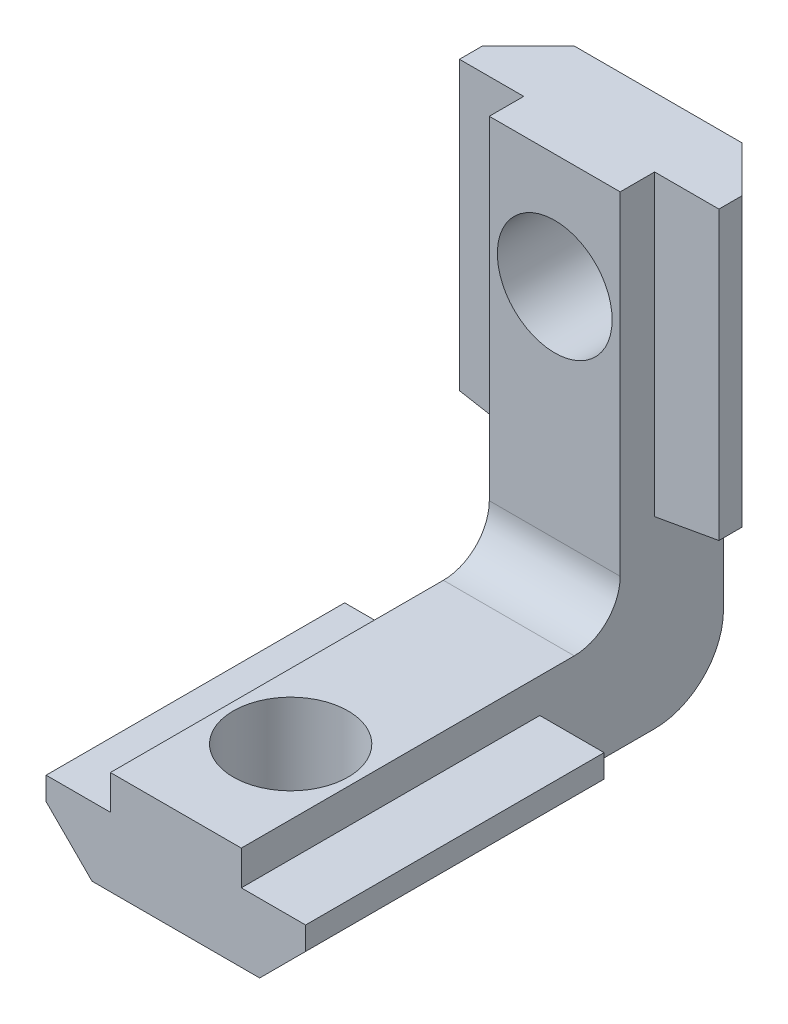
ISO-10303-21;
HEADER;
FILE_DESCRIPTION(('STEP AP214'),'2;1');
FILE_NAME('part.step','',(''),(''),'','','');
FILE_SCHEMA(('AUTOMOTIVE_DESIGN { 1 0 10303 214 1 1 1 1 }'));
ENDSEC;
DATA;
#1=APPLICATION_CONTEXT('core data for automotive mechanical design processes');
#2=APPLICATION_PROTOCOL_DEFINITION('international standard','automotive_design',2000,#1);
#3=PRODUCT_CONTEXT('',#1,'mechanical');
#4=PRODUCT('Part','Part','',(#3));
#5=PRODUCT_RELATED_PRODUCT_CATEGORY('part','',(#4));
#6=PRODUCT_DEFINITION_FORMATION('','',#4);
#7=PRODUCT_DEFINITION_CONTEXT('part definition',#1,'design');
#8=PRODUCT_DEFINITION('design','',#6,#7);
#9=PRODUCT_DEFINITION_SHAPE('','',#8);
#10=(LENGTH_UNIT() NAMED_UNIT(*) SI_UNIT(.MILLI.,.METRE.));
#11=(NAMED_UNIT(*) PLANE_ANGLE_UNIT() SI_UNIT($,.RADIAN.));
#12=(NAMED_UNIT(*) SI_UNIT($,.STERADIAN.) SOLID_ANGLE_UNIT());
#13=UNCERTAINTY_MEASURE_WITH_UNIT(LENGTH_MEASURE(1.E-05),#10,'distance_accuracy_value','');
#14=(GEOMETRIC_REPRESENTATION_CONTEXT(3) GLOBAL_UNCERTAINTY_ASSIGNED_CONTEXT((#13)) GLOBAL_UNIT_ASSIGNED_CONTEXT((#10,
#11,#12)) REPRESENTATION_CONTEXT('',''));
#15=CARTESIAN_POINT('',(0.,0.,0.));
#16=DIRECTION('',(0.,0.,1.));
#17=DIRECTION('',(1.,0.,0.));
#18=AXIS2_PLACEMENT_3D('',#15,#16,#17);
#19=CARTESIAN_POINT('',(2.85,3.,0.));
#20=DIRECTION('',(0.,0.,1.));
#21=DIRECTION('',(1.,0.,0.));
#22=AXIS2_PLACEMENT_3D('',#19,#20,#21);
#23=PLANE('',#22);
#24=DIRECTION('',(-1.,0.,0.));
#25=VECTOR('',#24,1.);
#26=CARTESIAN_POINT('',(2.85,3.,0.));
#27=LINE('',#26,#25);
#28=CARTESIAN_POINT('',(2.85,3.,0.));
#29=VERTEX_POINT('',#28);
#30=CARTESIAN_POINT('',(-2.85,3.,0.));
#31=VERTEX_POINT('',#30);
#32=EDGE_CURVE('E245',#29,#31,#27,.T.);
#33=ORIENTED_EDGE('',*,*,#32,.T.);
#34=DIRECTION('',(0.,1.,0.));
#35=VECTOR('',#34,1.);
#36=CARTESIAN_POINT('',(-2.85,3.,0.));
#37=LINE('',#36,#35);
#38=CARTESIAN_POINT('',(-2.85,8.,0.));
#39=VERTEX_POINT('',#38);
#40=EDGE_CURVE('E283',#31,#39,#37,.T.);
#41=ORIENTED_EDGE('',*,*,#40,.T.);
#42=DIRECTION('',(-0.984427575508482,0.175790638483658,0.));
#43=VECTOR('',#42,1.);
#44=CARTESIAN_POINT('',(-5.65,8.5,0.));
#45=LINE('',#44,#43);
#46=CARTESIAN_POINT('',(-3.65000000000001,8.14285714285715,0.));
#47=VERTEX_POINT('',#46);
#48=EDGE_CURVE('E461',#39,#47,#45,.T.);
#49=ORIENTED_EDGE('',*,*,#48,.T.);
#50=DIRECTION('',(0.,1.,0.));
#51=VECTOR('',#50,1.);
#52=CARTESIAN_POINT('',(-3.65000000000001,8.,0.));
#53=LINE('',#52,#51);
#54=CARTESIAN_POINT('',(-3.65000000000001,21.,0.));
#55=VERTEX_POINT('',#54);
#56=EDGE_CURVE('E467',#47,#55,#53,.T.);
#57=ORIENTED_EDGE('',*,*,#56,.T.);
#58=DIRECTION('',(-1.,0.,0.));
#59=VECTOR('',#58,1.);
#60=CARTESIAN_POINT('',(-3.65000000000001,21.,0.));
#61=LINE('',#60,#59);
#62=CARTESIAN_POINT('',(3.65000000000001,21.,0.));
#63=VERTEX_POINT('',#62);
#64=EDGE_CURVE('E464',#63,#55,#61,.T.);
#65=ORIENTED_EDGE('',*,*,#64,.F.);
#66=DIRECTION('',(0.,1.,0.));
#67=VECTOR('',#66,1.);
#68=CARTESIAN_POINT('',(3.65000000000001,8.,0.));
#69=LINE('',#68,#67);
#70=CARTESIAN_POINT('',(3.65000000000001,8.14285714285715,0.));
#71=VERTEX_POINT('',#70);
#72=EDGE_CURVE('E457',#71,#63,#69,.T.);
#73=ORIENTED_EDGE('',*,*,#72,.F.);
#74=DIRECTION('',(-0.984427575508482,-0.175790638483658,0.));
#75=VECTOR('',#74,1.);
#76=CARTESIAN_POINT('',(5.65,8.5,0.));
#77=LINE('',#76,#75);
#78=CARTESIAN_POINT('',(2.85,8.,0.));
#79=VERTEX_POINT('',#78);
#80=EDGE_CURVE('E383',#71,#79,#77,.T.);
#81=ORIENTED_EDGE('',*,*,#80,.T.);
#82=DIRECTION('',(0.,1.,0.));
#83=VECTOR('',#82,1.);
#84=CARTESIAN_POINT('',(2.85,3.,0.));
#85=LINE('',#84,#83);
#86=EDGE_CURVE('E268',#29,#79,#85,.T.);
#87=ORIENTED_EDGE('',*,*,#86,.F.);
#88=EDGE_LOOP('',(#33,#41,#49,#57,#65,#73,#81,#87));
#89=FACE_BOUND('',#88,.T.);
#90=CARTESIAN_POINT('',(0.,16.,0.));
#91=DIRECTION('',(0.,0.,1.));
#92=DIRECTION('',(1.,0.,0.));
#93=AXIS2_PLACEMENT_3D('',#90,#91,#92);
#94=CIRCLE('',#93,2.5);
#95=CARTESIAN_POINT('',(2.5,16.,0.));
#96=VERTEX_POINT('',#95);
#97=EDGE_CURVE('E532',#96,#96,#94,.T.);
#98=ORIENTED_EDGE('',*,*,#97,.T.);
#99=EDGE_LOOP('',(#98));
#100=FACE_BOUND('',#99,.T.);
#101=ADVANCED_FACE('F41',(#89,#100),#23,.F.);
#102=CARTESIAN_POINT('',(2.85,6.5,4.5));
#103=DIRECTION('',(0.,0.,-1.));
#104=DIRECTION('',(-1.,0.,0.));
#105=AXIS2_PLACEMENT_3D('',#102,#103,#104);
#106=PLANE('',#105);
#107=DIRECTION('',(0.,-1.,0.));
#108=VECTOR('',#107,1.);
#109=CARTESIAN_POINT('',(2.85,6.5,4.5));
#110=LINE('',#109,#108);
#111=CARTESIAN_POINT('',(2.85,21.,4.5));
#112=VERTEX_POINT('',#111);
#113=CARTESIAN_POINT('',(2.85,6.5,4.5));
#114=VERTEX_POINT('',#113);
#115=EDGE_CURVE('E261',#112,#114,#110,.T.);
#116=ORIENTED_EDGE('',*,*,#115,.F.);
#117=DIRECTION('',(1.,0.,0.));
#118=VECTOR('',#117,1.);
#119=CARTESIAN_POINT('',(-2.85,21.,4.5));
#120=LINE('',#119,#118);
#121=CARTESIAN_POINT('',(-2.85,21.,4.5));
#122=VERTEX_POINT('',#121);
#123=EDGE_CURVE('E508',#122,#112,#120,.T.);
#124=ORIENTED_EDGE('',*,*,#123,.F.);
#125=DIRECTION('',(0.,-1.,0.));
#126=VECTOR('',#125,1.);
#127=CARTESIAN_POINT('',(-2.85,6.5,4.5));
#128=LINE('',#127,#126);
#129=CARTESIAN_POINT('',(-2.85,6.5,4.5));
#130=VERTEX_POINT('',#129);
#131=EDGE_CURVE('E282',#122,#130,#128,.T.);
#132=ORIENTED_EDGE('',*,*,#131,.T.);
#133=DIRECTION('',(-1.,0.,0.));
#134=VECTOR('',#133,1.);
#135=CARTESIAN_POINT('',(2.85,6.5,4.5));
#136=LINE('',#135,#134);
#137=EDGE_CURVE('E249',#114,#130,#136,.T.);
#138=ORIENTED_EDGE('',*,*,#137,.F.);
#139=EDGE_LOOP('',(#116,#124,#132,#138));
#140=FACE_BOUND('',#139,.T.);
#141=CARTESIAN_POINT('',(0.,16.,4.5));
#142=DIRECTION('',(0.,0.,1.));
#143=DIRECTION('',(1.,0.,0.));
#144=AXIS2_PLACEMENT_3D('',#141,#142,#143);
#145=CIRCLE('',#144,2.5);
#146=CARTESIAN_POINT('',(2.5,16.,4.5));
#147=VERTEX_POINT('',#146);
#148=EDGE_CURVE('E451',#147,#147,#145,.T.);
#149=ORIENTED_EDGE('',*,*,#148,.F.);
#150=EDGE_LOOP('',(#149));
#151=FACE_BOUND('',#150,.T.);
#152=ADVANCED_FACE('F547',(#140,#151),#106,.F.);
#153=CARTESIAN_POINT('',(-2.85,3.,8.));
#154=DIRECTION('',(0.,0.,1.));
#155=DIRECTION('',(1.,0.,0.));
#156=AXIS2_PLACEMENT_3D('',#153,#154,#155);
#157=PLANE('',#156);
#158=DIRECTION('',(0.,-1.,0.));
#159=VECTOR('',#158,1.);
#160=CARTESIAN_POINT('',(2.85,4.5,8.));
#161=LINE('',#160,#159);
#162=CARTESIAN_POINT('',(2.85,3.,8.));
#163=VERTEX_POINT('',#162);
#164=CARTESIAN_POINT('',(2.85,0.,8.));
#165=VERTEX_POINT('',#164);
#166=EDGE_CURVE('E51',#163,#165,#161,.T.);
#167=ORIENTED_EDGE('',*,*,#166,.F.);
#168=DIRECTION('',(-1.,0.,0.));
#169=VECTOR('',#168,1.);
#170=CARTESIAN_POINT('',(5.65,3.,8.));
#171=LINE('',#170,#169);
#172=CARTESIAN_POINT('',(5.65,3.,8.));
#173=VERTEX_POINT('',#172);
#174=EDGE_CURVE('E131',#173,#163,#171,.T.);
#175=ORIENTED_EDGE('',*,*,#174,.F.);
#176=DIRECTION('',(0.,1.,0.));
#177=VECTOR('',#176,1.);
#178=CARTESIAN_POINT('',(5.65,2.,8.));
#179=LINE('',#178,#177);
#180=CARTESIAN_POINT('',(5.65,2.,8.));
#181=VERTEX_POINT('',#180);
#182=EDGE_CURVE('E146',#181,#173,#179,.T.);
#183=ORIENTED_EDGE('',*,*,#182,.F.);
#184=DIRECTION('',(0.707106781186551,0.707106781186544,0.));
#185=VECTOR('',#184,1.);
#186=CARTESIAN_POINT('',(3.64999999999998,0.,8.));
#187=LINE('',#186,#185);
#188=CARTESIAN_POINT('',(3.64999999999998,0.,8.));
#189=VERTEX_POINT('',#188);
#190=EDGE_CURVE('E155',#189,#181,#187,.T.);
#191=ORIENTED_EDGE('',*,*,#190,.F.);
#192=DIRECTION('',(1.,0.,0.));
#193=VECTOR('',#192,1.);
#194=CARTESIAN_POINT('',(-3.64999999999998,0.,8.));
#195=LINE('',#194,#193);
#196=EDGE_CURVE('E222',#165,#189,#195,.T.);
#197=ORIENTED_EDGE('',*,*,#196,.F.);
#198=EDGE_LOOP('',(#167,#175,#183,#191,#197));
#199=FACE_BOUND('',#198,.T.);
#200=ADVANCED_FACE('F144',(#199),#157,.F.);
#201=CARTESIAN_POINT('',(-5.65,3.,8.));
#202=DIRECTION('',(0.,1.,0.));
#203=DIRECTION('',(0.,0.,1.));
#204=AXIS2_PLACEMENT_3D('',#201,#202,#203);
#205=PLANE('',#204);
#206=DIRECTION('',(-1.,0.,0.));
#207=VECTOR('',#206,1.);
#208=CARTESIAN_POINT('',(-5.65,3.,21.));
#209=LINE('',#208,#207);
#210=CARTESIAN_POINT('',(-2.85,3.,21.));
#211=VERTEX_POINT('',#210);
#212=CARTESIAN_POINT('',(-5.65,3.,21.));
#213=VERTEX_POINT('',#212);
#214=EDGE_CURVE('E162',#211,#213,#209,.T.);
#215=ORIENTED_EDGE('',*,*,#214,.F.);
#216=DIRECTION('',(0.,0.,1.));
#217=VECTOR('',#216,1.);
#218=CARTESIAN_POINT('',(-2.85,3.,8.));
#219=LINE('',#218,#217);
#220=CARTESIAN_POINT('',(-2.85,3.,8.));
#221=VERTEX_POINT('',#220);
#222=EDGE_CURVE('E66',#221,#211,#219,.T.);
#223=ORIENTED_EDGE('',*,*,#222,.F.);
#224=DIRECTION('',(-1.,0.,0.));
#225=VECTOR('',#224,1.);
#226=CARTESIAN_POINT('',(-5.65,3.,8.));
#227=LINE('',#226,#225);
#228=CARTESIAN_POINT('',(-5.65,3.,8.));
#229=VERTEX_POINT('',#228);
#230=EDGE_CURVE('E200',#221,#229,#227,.T.);
#231=ORIENTED_EDGE('',*,*,#230,.T.);
#232=DIRECTION('',(0.,0.,1.));
#233=VECTOR('',#232,1.);
#234=CARTESIAN_POINT('',(-5.65,3.,8.));
#235=LINE('',#234,#233);
#236=EDGE_CURVE('E109',#229,#213,#235,.T.);
#237=ORIENTED_EDGE('',*,*,#236,.T.);
#238=EDGE_LOOP('',(#215,#223,#231,#237));
#239=FACE_BOUND('',#238,.T.);
#240=ADVANCED_FACE('F43',(#239),#205,.T.);
#241=CARTESIAN_POINT('',(-2.85,3.,8.));
#242=DIRECTION('',(-1.,0.,0.));
#243=DIRECTION('',(0.,0.,1.));
#244=AXIS2_PLACEMENT_3D('',#241,#242,#243);
#245=PLANE('',#244);
#246=DIRECTION('',(0.,-1.,0.));
#247=VECTOR('',#246,1.);
#248=CARTESIAN_POINT('',(-2.85,3.,21.));
#249=LINE('',#248,#247);
#250=CARTESIAN_POINT('',(-2.85,4.5,21.));
#251=VERTEX_POINT('',#250);
#252=EDGE_CURVE('E196',#251,#211,#249,.T.);
#253=ORIENTED_EDGE('',*,*,#252,.F.);
#254=DIRECTION('',(0.,0.,1.));
#255=VECTOR('',#254,1.);
#256=CARTESIAN_POINT('',(-2.85,4.5,8.));
#257=LINE('',#256,#255);
#258=CARTESIAN_POINT('',(-2.85,4.5,6.5));
#259=VERTEX_POINT('',#258);
#260=EDGE_CURVE('E201',#259,#251,#257,.T.);
#261=ORIENTED_EDGE('',*,*,#260,.F.);
#262=CARTESIAN_POINT('',(-2.85,6.5,6.5));
#263=DIRECTION('',(-1.,0.,0.));
#264=DIRECTION('',(0.,0.,-1.));
#265=AXIS2_PLACEMENT_3D('',#262,#263,#264);
#266=CIRCLE('',#265,2.);
#267=EDGE_CURVE('E293',#130,#259,#266,.T.);
#268=ORIENTED_EDGE('',*,*,#267,.F.);
#269=ORIENTED_EDGE('',*,*,#131,.F.);
#270=DIRECTION('',(0.,0.,1.));
#271=VECTOR('',#270,1.);
#272=CARTESIAN_POINT('',(-2.85,21.,4.5));
#273=LINE('',#272,#271);
#274=CARTESIAN_POINT('',(-2.85,21.,3.));
#275=VERTEX_POINT('',#274);
#276=EDGE_CURVE('E512',#275,#122,#273,.T.);
#277=ORIENTED_EDGE('',*,*,#276,.F.);
#278=DIRECTION('',(0.,1.,0.));
#279=VECTOR('',#278,1.);
#280=CARTESIAN_POINT('',(-2.85,8.,3.));
#281=LINE('',#280,#279);
#282=CARTESIAN_POINT('',(-2.85,8.,3.));
#283=VERTEX_POINT('',#282);
#284=EDGE_CURVE('E320',#283,#275,#281,.T.);
#285=ORIENTED_EDGE('',*,*,#284,.F.);
#286=DIRECTION('',(0.,0.,1.));
#287=VECTOR('',#286,1.);
#288=CARTESIAN_POINT('',(-2.85,8.,0.));
#289=LINE('',#288,#287);
#290=EDGE_CURVE('E277',#39,#283,#289,.T.);
#291=ORIENTED_EDGE('',*,*,#290,.F.);
#292=ORIENTED_EDGE('',*,*,#40,.F.);
#293=CARTESIAN_POINT('',(-2.85,3.,3.));
#294=DIRECTION('',(1.,0.,0.));
#295=DIRECTION('',(0.,0.,-1.));
#296=AXIS2_PLACEMENT_3D('',#293,#294,#295);
#297=CIRCLE('',#296,3.);
#298=CARTESIAN_POINT('',(-2.85,0.,3.));
#299=VERTEX_POINT('',#298);
#300=EDGE_CURVE('E308',#299,#31,#297,.T.);
#301=ORIENTED_EDGE('',*,*,#300,.F.);
#302=DIRECTION('',(0.,0.,-1.));
#303=VECTOR('',#302,1.);
#304=CARTESIAN_POINT('',(-2.85,0.,8.));
#305=LINE('',#304,#303);
#306=CARTESIAN_POINT('',(-2.85,0.,8.));
#307=VERTEX_POINT('',#306);
#308=EDGE_CURVE('E311',#307,#299,#305,.T.);
#309=ORIENTED_EDGE('',*,*,#308,.F.);
#310=DIRECTION('',(0.,-1.,0.));
#311=VECTOR('',#310,1.);
#312=CARTESIAN_POINT('',(-2.85,4.5,8.));
#313=LINE('',#312,#311);
#314=EDGE_CURVE('E11',#221,#307,#313,.T.);
#315=ORIENTED_EDGE('',*,*,#314,.F.);
#316=ORIENTED_EDGE('',*,*,#222,.T.);
#317=EDGE_LOOP('',(#253,#261,#268,#269,#277,#285,#291,#292,#301,#309,#315,#316));
#318=FACE_BOUND('',#317,.T.);
#319=ADVANCED_FACE('F570',(#318),#245,.T.);
#320=CARTESIAN_POINT('',(-2.85,4.5,8.));
#321=DIRECTION('',(0.,1.,0.));
#322=DIRECTION('',(-1.,0.,0.));
#323=AXIS2_PLACEMENT_3D('',#320,#321,#322);
#324=PLANE('',#323);
#325=CARTESIAN_POINT('',(0.,4.5,16.));
#326=DIRECTION('',(0.,1.,0.));
#327=DIRECTION('',(-1.,0.,0.));
#328=AXIS2_PLACEMENT_3D('',#325,#326,#327);
#329=CIRCLE('',#328,2.5);
#330=CARTESIAN_POINT('',(-2.5,4.5,16.));
#331=VERTEX_POINT('',#330);
#332=EDGE_CURVE('E234',#331,#331,#329,.T.);
#333=ORIENTED_EDGE('',*,*,#332,.F.);
#334=EDGE_LOOP('',(#333));
#335=FACE_BOUND('',#334,.T.);
#336=DIRECTION('',(-1.,0.,0.));
#337=VECTOR('',#336,1.);
#338=CARTESIAN_POINT('',(-2.85,4.5,21.));
#339=LINE('',#338,#337);
#340=CARTESIAN_POINT('',(2.85,4.5,21.));
#341=VERTEX_POINT('',#340);
#342=EDGE_CURVE('E192',#341,#251,#339,.T.);
#343=ORIENTED_EDGE('',*,*,#342,.F.);
#344=DIRECTION('',(0.,0.,1.));
#345=VECTOR('',#344,1.);
#346=CARTESIAN_POINT('',(2.85,4.5,8.));
#347=LINE('',#346,#345);
#348=CARTESIAN_POINT('',(2.85,4.5,6.5));
#349=VERTEX_POINT('',#348);
#350=EDGE_CURVE('E204',#349,#341,#347,.T.);
#351=ORIENTED_EDGE('',*,*,#350,.F.);
#352=DIRECTION('',(-1.,0.,0.));
#353=VECTOR('',#352,1.);
#354=CARTESIAN_POINT('',(2.85,4.5,6.5));
#355=LINE('',#354,#353);
#356=EDGE_CURVE('E253',#349,#259,#355,.T.);
#357=ORIENTED_EDGE('',*,*,#356,.T.);
#358=ORIENTED_EDGE('',*,*,#260,.T.);
#359=EDGE_LOOP('',(#343,#351,#357,#358));
#360=FACE_BOUND('',#359,.T.);
#361=ADVANCED_FACE('F573',(#335,#360),#324,.T.);
#362=CARTESIAN_POINT('',(2.85,3.,8.));
#363=DIRECTION('',(1.,0.,0.));
#364=DIRECTION('',(0.,0.,-1.));
#365=AXIS2_PLACEMENT_3D('',#362,#363,#364);
#366=PLANE('',#365);
#367=DIRECTION('',(0.,1.,0.));
#368=VECTOR('',#367,1.);
#369=CARTESIAN_POINT('',(2.85,3.,21.));
#370=LINE('',#369,#368);
#371=CARTESIAN_POINT('',(2.85,3.,21.));
#372=VERTEX_POINT('',#371);
#373=EDGE_CURVE('E188',#372,#341,#370,.T.);
#374=ORIENTED_EDGE('',*,*,#373,.F.);
#375=DIRECTION('',(0.,0.,1.));
#376=VECTOR('',#375,1.);
#377=CARTESIAN_POINT('',(2.85,3.,8.));
#378=LINE('',#377,#376);
#379=EDGE_CURVE('E139',#163,#372,#378,.T.);
#380=ORIENTED_EDGE('',*,*,#379,.F.);
#381=ORIENTED_EDGE('',*,*,#166,.T.);
#382=DIRECTION('',(0.,0.,-1.));
#383=VECTOR('',#382,1.);
#384=CARTESIAN_POINT('',(2.85,0.,8.));
#385=LINE('',#384,#383);
#386=CARTESIAN_POINT('',(2.85,0.,3.));
#387=VERTEX_POINT('',#386);
#388=EDGE_CURVE('E297',#165,#387,#385,.T.);
#389=ORIENTED_EDGE('',*,*,#388,.T.);
#390=CARTESIAN_POINT('',(2.85,3.,3.));
#391=DIRECTION('',(1.,0.,0.));
#392=DIRECTION('',(0.,0.,-1.));
#393=AXIS2_PLACEMENT_3D('',#390,#391,#392);
#394=CIRCLE('',#393,3.);
#395=EDGE_CURVE('E299',#387,#29,#394,.T.);
#396=ORIENTED_EDGE('',*,*,#395,.T.);
#397=ORIENTED_EDGE('',*,*,#86,.T.);
#398=DIRECTION('',(0.,0.,1.));
#399=VECTOR('',#398,1.);
#400=CARTESIAN_POINT('',(2.85,8.,0.));
#401=LINE('',#400,#399);
#402=CARTESIAN_POINT('',(2.85,8.,3.));
#403=VERTEX_POINT('',#402);
#404=EDGE_CURVE('E265',#79,#403,#401,.T.);
#405=ORIENTED_EDGE('',*,*,#404,.T.);
#406=DIRECTION('',(0.,1.,0.));
#407=VECTOR('',#406,1.);
#408=CARTESIAN_POINT('',(2.85,8.,3.));
#409=LINE('',#408,#407);
#410=CARTESIAN_POINT('',(2.85,21.,3.));
#411=VERTEX_POINT('',#410);
#412=EDGE_CURVE('E482',#403,#411,#409,.T.);
#413=ORIENTED_EDGE('',*,*,#412,.T.);
#414=DIRECTION('',(0.,0.,-1.));
#415=VECTOR('',#414,1.);
#416=CARTESIAN_POINT('',(2.85,21.,4.5));
#417=LINE('',#416,#415);
#418=EDGE_CURVE('E504',#112,#411,#417,.T.);
#419=ORIENTED_EDGE('',*,*,#418,.F.);
#420=ORIENTED_EDGE('',*,*,#115,.T.);
#421=CARTESIAN_POINT('',(2.85,6.5,6.5));
#422=DIRECTION('',(-1.,0.,0.));
#423=DIRECTION('',(0.,0.,-1.));
#424=AXIS2_PLACEMENT_3D('',#421,#422,#423);
#425=CIRCLE('',#424,2.);
#426=EDGE_CURVE('E257',#114,#349,#425,.T.);
#427=ORIENTED_EDGE('',*,*,#426,.T.);
#428=ORIENTED_EDGE('',*,*,#350,.T.);
#429=EDGE_LOOP('',(#374,#380,#381,#389,#396,#397,#405,#413,#419,#420,#427,#428));
#430=FACE_BOUND('',#429,.T.);
#431=ADVANCED_FACE('F345',(#430),#366,.T.);
#432=CARTESIAN_POINT('',(5.65,3.,8.));
#433=DIRECTION('',(0.,1.,0.));
#434=DIRECTION('',(-1.,0.,0.));
#435=AXIS2_PLACEMENT_3D('',#432,#433,#434);
#436=PLANE('',#435);
#437=DIRECTION('',(-1.,0.,0.));
#438=VECTOR('',#437,1.);
#439=CARTESIAN_POINT('',(5.65,3.,21.));
#440=LINE('',#439,#438);
#441=CARTESIAN_POINT('',(5.65,3.,21.));
#442=VERTEX_POINT('',#441);
#443=EDGE_CURVE('E133',#442,#372,#440,.T.);
#444=ORIENTED_EDGE('',*,*,#443,.F.);
#445=DIRECTION('',(0.,0.,1.));
#446=VECTOR('',#445,1.);
#447=CARTESIAN_POINT('',(5.65,3.,8.));
#448=LINE('',#447,#446);
#449=EDGE_CURVE('E128',#173,#442,#448,.T.);
#450=ORIENTED_EDGE('',*,*,#449,.F.);
#451=ORIENTED_EDGE('',*,*,#174,.T.);
#452=ORIENTED_EDGE('',*,*,#379,.T.);
#453=EDGE_LOOP('',(#444,#450,#451,#452));
#454=FACE_BOUND('',#453,.T.);
#455=ADVANCED_FACE('F130',(#454),#436,.T.);
#456=CARTESIAN_POINT('',(5.65,2.,8.));
#457=DIRECTION('',(1.,0.,0.));
#458=DIRECTION('',(0.,0.,-1.));
#459=AXIS2_PLACEMENT_3D('',#456,#457,#458);
#460=PLANE('',#459);
#461=DIRECTION('',(0.,1.,0.));
#462=VECTOR('',#461,1.);
#463=CARTESIAN_POINT('',(5.65,2.,21.));
#464=LINE('',#463,#462);
#465=CARTESIAN_POINT('',(5.65,2.,21.));
#466=VERTEX_POINT('',#465);
#467=EDGE_CURVE('E183',#466,#442,#464,.T.);
#468=ORIENTED_EDGE('',*,*,#467,.F.);
#469=DIRECTION('',(0.,0.,1.));
#470=VECTOR('',#469,1.);
#471=CARTESIAN_POINT('',(5.65,2.,8.));
#472=LINE('',#471,#470);
#473=EDGE_CURVE('E140',#181,#466,#472,.T.);
#474=ORIENTED_EDGE('',*,*,#473,.F.);
#475=ORIENTED_EDGE('',*,*,#182,.T.);
#476=ORIENTED_EDGE('',*,*,#449,.T.);
#477=EDGE_LOOP('',(#468,#474,#475,#476));
#478=FACE_BOUND('',#477,.T.);
#479=ADVANCED_FACE('F153',(#478),#460,.T.);
#480=CARTESIAN_POINT('',(3.64999999999998,0.,8.));
#481=DIRECTION('',(0.707106781186544,-0.707106781186551,0.));
#482=DIRECTION('',(0.707106781186551,0.707106781186544,0.));
#483=AXIS2_PLACEMENT_3D('',#480,#481,#482);
#484=PLANE('',#483);
#485=DIRECTION('',(0.707106781186551,0.707106781186544,0.));
#486=VECTOR('',#485,1.);
#487=CARTESIAN_POINT('',(3.64999999999998,0.,21.));
#488=LINE('',#487,#486);
#489=CARTESIAN_POINT('',(3.64999999999998,0.,21.));
#490=VERTEX_POINT('',#489);
#491=EDGE_CURVE('E179',#490,#466,#488,.T.);
#492=ORIENTED_EDGE('',*,*,#491,.F.);
#493=DIRECTION('',(0.,0.,1.));
#494=VECTOR('',#493,1.);
#495=CARTESIAN_POINT('',(3.64999999999998,0.,8.));
#496=LINE('',#495,#494);
#497=EDGE_CURVE('E209',#189,#490,#496,.T.);
#498=ORIENTED_EDGE('',*,*,#497,.F.);
#499=ORIENTED_EDGE('',*,*,#190,.T.);
#500=ORIENTED_EDGE('',*,*,#473,.T.);
#501=EDGE_LOOP('',(#492,#498,#499,#500));
#502=FACE_BOUND('',#501,.T.);
#503=ADVANCED_FACE('F354',(#502),#484,.T.);
#504=CARTESIAN_POINT('',(-3.64999999999998,0.,8.));
#505=DIRECTION('',(0.,-1.,0.));
#506=DIRECTION('',(1.,0.,0.));
#507=AXIS2_PLACEMENT_3D('',#504,#505,#506);
#508=PLANE('',#507);
#509=CARTESIAN_POINT('',(0.,0.,16.));
#510=DIRECTION('',(0.,1.,0.));
#511=DIRECTION('',(-1.,0.,0.));
#512=AXIS2_PLACEMENT_3D('',#509,#510,#511);
#513=CIRCLE('',#512,2.5);
#514=CARTESIAN_POINT('',(-2.5,0.,16.));
#515=VERTEX_POINT('',#514);
#516=EDGE_CURVE('E167',#515,#515,#513,.T.);
#517=ORIENTED_EDGE('',*,*,#516,.T.);
#518=EDGE_LOOP('',(#517));
#519=FACE_BOUND('',#518,.T.);
#520=DIRECTION('',(1.,0.,0.));
#521=VECTOR('',#520,1.);
#522=CARTESIAN_POINT('',(-3.64999999999998,0.,21.));
#523=LINE('',#522,#521);
#524=CARTESIAN_POINT('',(-3.64999999999998,0.,21.));
#525=VERTEX_POINT('',#524);
#526=EDGE_CURVE('E175',#525,#490,#523,.T.);
#527=ORIENTED_EDGE('',*,*,#526,.F.);
#528=DIRECTION('',(0.,0.,1.));
#529=VECTOR('',#528,1.);
#530=CARTESIAN_POINT('',(-3.64999999999998,0.,8.));
#531=LINE('',#530,#529);
#532=CARTESIAN_POINT('',(-3.64999999999998,0.,8.));
#533=VERTEX_POINT('',#532);
#534=EDGE_CURVE('E212',#533,#525,#531,.T.);
#535=ORIENTED_EDGE('',*,*,#534,.F.);
#536=EDGE_CURVE('E158',#533,#307,#195,.T.);
#537=ORIENTED_EDGE('',*,*,#536,.T.);
#538=ORIENTED_EDGE('',*,*,#308,.T.);
#539=DIRECTION('',(-1.,0.,0.));
#540=VECTOR('',#539,1.);
#541=CARTESIAN_POINT('',(2.85,0.,3.));
#542=LINE('',#541,#540);
#543=EDGE_CURVE('E238',#387,#299,#542,.T.);
#544=ORIENTED_EDGE('',*,*,#543,.F.);
#545=ORIENTED_EDGE('',*,*,#388,.F.);
#546=ORIENTED_EDGE('',*,*,#196,.T.);
#547=ORIENTED_EDGE('',*,*,#497,.T.);
#548=EDGE_LOOP('',(#527,#535,#537,#538,#544,#545,#546,#547));
#549=FACE_BOUND('',#548,.T.);
#550=ADVANCED_FACE('F363',(#519,#549),#508,.T.);
#551=CARTESIAN_POINT('',(-3.64999999999998,0.,8.));
#552=DIRECTION('',(-0.707106781186544,-0.707106781186551,0.));
#553=DIRECTION('',(0.707106781186551,-0.707106781186544,0.));
#554=AXIS2_PLACEMENT_3D('',#551,#552,#553);
#555=PLANE('',#554);
#556=DIRECTION('',(0.707106781186551,-0.707106781186544,0.));
#557=VECTOR('',#556,1.);
#558=CARTESIAN_POINT('',(-3.64999999999998,0.,21.));
#559=LINE('',#558,#557);
#560=CARTESIAN_POINT('',(-5.65,2.,21.));
#561=VERTEX_POINT('',#560);
#562=EDGE_CURVE('E171',#561,#525,#559,.T.);
#563=ORIENTED_EDGE('',*,*,#562,.F.);
#564=DIRECTION('',(0.,0.,1.));
#565=VECTOR('',#564,1.);
#566=CARTESIAN_POINT('',(-5.65,2.,8.));
#567=LINE('',#566,#565);
#568=CARTESIAN_POINT('',(-5.65,2.,8.));
#569=VERTEX_POINT('',#568);
#570=EDGE_CURVE('E215',#569,#561,#567,.T.);
#571=ORIENTED_EDGE('',*,*,#570,.F.);
#572=DIRECTION('',(0.707106781186551,-0.707106781186544,0.));
#573=VECTOR('',#572,1.);
#574=CARTESIAN_POINT('',(-3.64999999999998,0.,8.));
#575=LINE('',#574,#573);
#576=EDGE_CURVE('E226',#569,#533,#575,.T.);
#577=ORIENTED_EDGE('',*,*,#576,.T.);
#578=ORIENTED_EDGE('',*,*,#534,.T.);
#579=EDGE_LOOP('',(#563,#571,#577,#578));
#580=FACE_BOUND('',#579,.T.);
#581=ADVANCED_FACE('F587',(#580),#555,.T.);
#582=CARTESIAN_POINT('',(-5.65,2.,8.));
#583=DIRECTION('',(-1.,0.,0.));
#584=DIRECTION('',(0.,0.,1.));
#585=AXIS2_PLACEMENT_3D('',#582,#583,#584);
#586=PLANE('',#585);
#587=DIRECTION('',(0.,-1.,0.));
#588=VECTOR('',#587,1.);
#589=CARTESIAN_POINT('',(-5.65,2.,21.));
#590=LINE('',#589,#588);
#591=EDGE_CURVE('E166',#213,#561,#590,.T.);
#592=ORIENTED_EDGE('',*,*,#591,.F.);
#593=ORIENTED_EDGE('',*,*,#236,.F.);
#594=DIRECTION('',(0.,-1.,0.));
#595=VECTOR('',#594,1.);
#596=CARTESIAN_POINT('',(-5.65,2.,8.));
#597=LINE('',#596,#595);
#598=EDGE_CURVE('E231',#229,#569,#597,.T.);
#599=ORIENTED_EDGE('',*,*,#598,.T.);
#600=ORIENTED_EDGE('',*,*,#570,.T.);
#601=EDGE_LOOP('',(#592,#593,#599,#600));
#602=FACE_BOUND('',#601,.T.);
#603=ADVANCED_FACE('F567',(#602),#586,.T.);
#604=ORIENTED_EDGE('',*,*,#230,.F.);
#605=ORIENTED_EDGE('',*,*,#314,.T.);
#606=ORIENTED_EDGE('',*,*,#536,.F.);
#607=ORIENTED_EDGE('',*,*,#576,.F.);
#608=ORIENTED_EDGE('',*,*,#598,.F.);
#609=EDGE_LOOP('',(#604,#605,#606,#607,#608));
#610=FACE_BOUND('',#609,.T.);
#611=ADVANCED_FACE('F564',(#610),#157,.F.);
#612=CARTESIAN_POINT('',(-2.85,3.,21.));
#613=DIRECTION('',(0.,0.,1.));
#614=DIRECTION('',(1.,0.,0.));
#615=AXIS2_PLACEMENT_3D('',#612,#613,#614);
#616=PLANE('',#615);
#617=ORIENTED_EDGE('',*,*,#214,.T.);
#618=ORIENTED_EDGE('',*,*,#591,.T.);
#619=ORIENTED_EDGE('',*,*,#562,.T.);
#620=ORIENTED_EDGE('',*,*,#526,.T.);
#621=ORIENTED_EDGE('',*,*,#491,.T.);
#622=ORIENTED_EDGE('',*,*,#467,.T.);
#623=ORIENTED_EDGE('',*,*,#443,.T.);
#624=ORIENTED_EDGE('',*,*,#373,.T.);
#625=ORIENTED_EDGE('',*,*,#342,.T.);
#626=ORIENTED_EDGE('',*,*,#252,.T.);
#627=EDGE_LOOP('',(#617,#618,#619,#620,#621,#622,#623,#624,#625,#626));
#628=FACE_BOUND('',#627,.T.);
#629=ADVANCED_FACE('F349',(#628),#616,.T.);
#630=CARTESIAN_POINT('',(0.,0.,16.));
#631=DIRECTION('',(0.,1.,0.));
#632=DIRECTION('',(-1.,0.,0.));
#633=AXIS2_PLACEMENT_3D('',#630,#631,#632);
#634=CYLINDRICAL_SURFACE('',#633,2.5);
#635=ORIENTED_EDGE('',*,*,#516,.F.);
#636=EDGE_LOOP('',(#635));
#637=FACE_BOUND('',#636,.T.);
#638=ORIENTED_EDGE('',*,*,#332,.T.);
#639=EDGE_LOOP('',(#638));
#640=FACE_BOUND('',#639,.T.);
#641=ADVANCED_FACE('F560',(#637,#640),#634,.F.);
#642=CARTESIAN_POINT('',(2.85,3.,3.));
#643=DIRECTION('',(-1.,0.,0.));
#644=DIRECTION('',(0.,0.,1.));
#645=AXIS2_PLACEMENT_3D('',#642,#643,#644);
#646=CYLINDRICAL_SURFACE('',#645,3.);
#647=ORIENTED_EDGE('',*,*,#543,.T.);
#648=ORIENTED_EDGE('',*,*,#300,.T.);
#649=ORIENTED_EDGE('',*,*,#32,.F.);
#650=ORIENTED_EDGE('',*,*,#395,.F.);
#651=EDGE_LOOP('',(#647,#648,#649,#650));
#652=FACE_BOUND('',#651,.T.);
#653=ADVANCED_FACE('F556',(#652),#646,.T.);
#654=CARTESIAN_POINT('',(2.85,6.5,6.5));
#655=DIRECTION('',(-1.,0.,0.));
#656=DIRECTION('',(0.,0.,1.));
#657=AXIS2_PLACEMENT_3D('',#654,#655,#656);
#658=CYLINDRICAL_SURFACE('',#657,2.);
#659=ORIENTED_EDGE('',*,*,#137,.T.);
#660=ORIENTED_EDGE('',*,*,#267,.T.);
#661=ORIENTED_EDGE('',*,*,#356,.F.);
#662=ORIENTED_EDGE('',*,*,#426,.F.);
#663=EDGE_LOOP('',(#659,#660,#661,#662));
#664=FACE_BOUND('',#663,.T.);
#665=ADVANCED_FACE('F559',(#664),#658,.F.);
#666=CARTESIAN_POINT('',(-2.85,8.,3.));
#667=DIRECTION('',(0.,0.,1.));
#668=DIRECTION('',(1.,0.,0.));
#669=AXIS2_PLACEMENT_3D('',#666,#667,#668);
#670=PLANE('',#669);
#671=DIRECTION('',(-0.984427575508482,0.175790638483658,0.));
#672=VECTOR('',#671,1.);
#673=CARTESIAN_POINT('',(-2.85,8.,3.));
#674=LINE('',#673,#672);
#675=CARTESIAN_POINT('',(-5.65,8.5,3.));
#676=VERTEX_POINT('',#675);
#677=EDGE_CURVE('E516',#283,#676,#674,.T.);
#678=ORIENTED_EDGE('',*,*,#677,.F.);
#679=ORIENTED_EDGE('',*,*,#284,.T.);
#680=DIRECTION('',(1.,0.,0.));
#681=VECTOR('',#680,1.);
#682=CARTESIAN_POINT('',(-2.85,21.,3.));
#683=LINE('',#682,#681);
#684=CARTESIAN_POINT('',(-5.65,21.,3.));
#685=VERTEX_POINT('',#684);
#686=EDGE_CURVE('E478',#685,#275,#683,.T.);
#687=ORIENTED_EDGE('',*,*,#686,.F.);
#688=DIRECTION('',(0.,1.,0.));
#689=VECTOR('',#688,1.);
#690=CARTESIAN_POINT('',(-5.65,8.,3.));
#691=LINE('',#690,#689);
#692=EDGE_CURVE('E327',#676,#685,#691,.T.);
#693=ORIENTED_EDGE('',*,*,#692,.F.);
#694=EDGE_LOOP('',(#678,#679,#687,#693));
#695=FACE_BOUND('',#694,.T.);
#696=ADVANCED_FACE('F642',(#695),#670,.T.);
#697=CARTESIAN_POINT('',(-5.65,8.,3.));
#698=DIRECTION('',(-1.,0.,0.));
#699=DIRECTION('',(0.,0.,1.));
#700=AXIS2_PLACEMENT_3D('',#697,#698,#699);
#701=PLANE('',#700);
#702=DIRECTION('',(0.,0.,1.));
#703=VECTOR('',#702,1.);
#704=CARTESIAN_POINT('',(-5.65,8.5,0.));
#705=LINE('',#704,#703);
#706=CARTESIAN_POINT('',(-5.65,8.5,2.));
#707=VERTEX_POINT('',#706);
#708=EDGE_CURVE('E520',#707,#676,#705,.T.);
#709=ORIENTED_EDGE('',*,*,#708,.T.);
#710=ORIENTED_EDGE('',*,*,#692,.T.);
#711=DIRECTION('',(0.,0.,1.));
#712=VECTOR('',#711,1.);
#713=CARTESIAN_POINT('',(-5.65,21.,3.));
#714=LINE('',#713,#712);
#715=CARTESIAN_POINT('',(-5.65,21.,2.));
#716=VERTEX_POINT('',#715);
#717=EDGE_CURVE('E483',#716,#685,#714,.T.);
#718=ORIENTED_EDGE('',*,*,#717,.F.);
#719=DIRECTION('',(0.,1.,0.));
#720=VECTOR('',#719,1.);
#721=CARTESIAN_POINT('',(-5.65,8.,2.));
#722=LINE('',#721,#720);
#723=EDGE_CURVE('E471',#707,#716,#722,.T.);
#724=ORIENTED_EDGE('',*,*,#723,.F.);
#725=EDGE_LOOP('',(#709,#710,#718,#724));
#726=FACE_BOUND('',#725,.T.);
#727=ADVANCED_FACE('F644',(#726),#701,.T.);
#728=CARTESIAN_POINT('',(-5.65,8.,2.));
#729=DIRECTION('',(-0.707106781186549,0.,-0.707106781186546));
#730=DIRECTION('',(-0.707106781186546,0.,0.707106781186549));
#731=AXIS2_PLACEMENT_3D('',#728,#729,#730);
#732=PLANE('',#731);
#733=DIRECTION('',(0.701536292802639,-0.125274338000471,-0.701536292802642));
#734=VECTOR('',#733,1.);
#735=CARTESIAN_POINT('',(-5.60605775266792,8.49215317011928,1.95605775266792));
#736=LINE('',#735,#734);
#737=EDGE_CURVE('E517',#707,#47,#736,.T.);
#738=ORIENTED_EDGE('',*,*,#737,.F.);
#739=ORIENTED_EDGE('',*,*,#723,.T.);
#740=DIRECTION('',(-0.707106781186546,0.,0.707106781186549));
#741=VECTOR('',#740,1.);
#742=CARTESIAN_POINT('',(-5.65,21.,2.));
#743=LINE('',#742,#741);
#744=EDGE_CURVE('E487',#55,#716,#743,.T.);
#745=ORIENTED_EDGE('',*,*,#744,.F.);
#746=ORIENTED_EDGE('',*,*,#56,.F.);
#747=EDGE_LOOP('',(#738,#739,#745,#746));
#748=FACE_BOUND('',#747,.T.);
#749=ADVANCED_FACE('F603',(#748),#732,.T.);
#750=CARTESIAN_POINT('',(5.65,8.,2.));
#751=DIRECTION('',(0.707106781186549,0.,-0.707106781186546));
#752=DIRECTION('',(-0.707106781186546,0.,-0.707106781186549));
#753=AXIS2_PLACEMENT_3D('',#750,#751,#752);
#754=PLANE('',#753);
#755=DIRECTION('',(0.701536292802639,0.125274338000471,0.701536292802642));
#756=VECTOR('',#755,1.);
#757=CARTESIAN_POINT('',(5.60605775266792,8.49215317011927,1.95605775266792));
#758=LINE('',#757,#756);
#759=CARTESIAN_POINT('',(5.65,8.5,2.));
#760=VERTEX_POINT('',#759);
#761=EDGE_CURVE('E447',#71,#760,#758,.T.);
#762=ORIENTED_EDGE('',*,*,#761,.F.);
#763=ORIENTED_EDGE('',*,*,#72,.T.);
#764=DIRECTION('',(-0.707106781186546,0.,-0.707106781186549));
#765=VECTOR('',#764,1.);
#766=CARTESIAN_POINT('',(5.65,21.,2.));
#767=LINE('',#766,#765);
#768=CARTESIAN_POINT('',(5.65,21.,2.));
#769=VERTEX_POINT('',#768);
#770=EDGE_CURVE('E493',#769,#63,#767,.T.);
#771=ORIENTED_EDGE('',*,*,#770,.F.);
#772=DIRECTION('',(0.,1.,0.));
#773=VECTOR('',#772,1.);
#774=CARTESIAN_POINT('',(5.65,8.,2.));
#775=LINE('',#774,#773);
#776=EDGE_CURVE('E459',#760,#769,#775,.T.);
#777=ORIENTED_EDGE('',*,*,#776,.F.);
#778=EDGE_LOOP('',(#762,#763,#771,#777));
#779=FACE_BOUND('',#778,.T.);
#780=ADVANCED_FACE('F455',(#779),#754,.T.);
#781=CARTESIAN_POINT('',(5.65,8.,3.));
#782=DIRECTION('',(1.,0.,0.));
#783=DIRECTION('',(0.,0.,-1.));
#784=AXIS2_PLACEMENT_3D('',#781,#782,#783);
#785=PLANE('',#784);
#786=DIRECTION('',(0.,0.,1.));
#787=VECTOR('',#786,1.);
#788=CARTESIAN_POINT('',(5.65,8.5,0.));
#789=LINE('',#788,#787);
#790=CARTESIAN_POINT('',(5.65,8.5,3.));
#791=VERTEX_POINT('',#790);
#792=EDGE_CURVE('E450',#760,#791,#789,.T.);
#793=ORIENTED_EDGE('',*,*,#792,.F.);
#794=ORIENTED_EDGE('',*,*,#776,.T.);
#795=DIRECTION('',(0.,0.,-1.));
#796=VECTOR('',#795,1.);
#797=CARTESIAN_POINT('',(5.65,21.,3.));
#798=LINE('',#797,#796);
#799=CARTESIAN_POINT('',(5.65,21.,3.));
#800=VERTEX_POINT('',#799);
#801=EDGE_CURVE('E496',#800,#769,#798,.T.);
#802=ORIENTED_EDGE('',*,*,#801,.F.);
#803=DIRECTION('',(0.,1.,0.));
#804=VECTOR('',#803,1.);
#805=CARTESIAN_POINT('',(5.65,8.,3.));
#806=LINE('',#805,#804);
#807=EDGE_CURVE('E306',#791,#800,#806,.T.);
#808=ORIENTED_EDGE('',*,*,#807,.F.);
#809=EDGE_LOOP('',(#793,#794,#802,#808));
#810=FACE_BOUND('',#809,.T.);
#811=ADVANCED_FACE('F612',(#810),#785,.T.);
#812=CARTESIAN_POINT('',(2.85,8.,3.));
#813=DIRECTION('',(0.,0.,1.));
#814=DIRECTION('',(1.,0.,0.));
#815=AXIS2_PLACEMENT_3D('',#812,#813,#814);
#816=PLANE('',#815);
#817=DIRECTION('',(-0.984427575508482,-0.175790638483658,0.));
#818=VECTOR('',#817,1.);
#819=CARTESIAN_POINT('',(2.85,8.,3.));
#820=LINE('',#819,#818);
#821=EDGE_CURVE('E284',#791,#403,#820,.T.);
#822=ORIENTED_EDGE('',*,*,#821,.F.);
#823=ORIENTED_EDGE('',*,*,#807,.T.);
#824=DIRECTION('',(1.,0.,0.));
#825=VECTOR('',#824,1.);
#826=CARTESIAN_POINT('',(2.85,21.,3.));
#827=LINE('',#826,#825);
#828=EDGE_CURVE('E500',#411,#800,#827,.T.);
#829=ORIENTED_EDGE('',*,*,#828,.F.);
#830=ORIENTED_EDGE('',*,*,#412,.F.);
#831=EDGE_LOOP('',(#822,#823,#829,#830));
#832=FACE_BOUND('',#831,.T.);
#833=ADVANCED_FACE('F616',(#832),#816,.T.);
#834=CARTESIAN_POINT('',(-2.85,21.,3.));
#835=DIRECTION('',(0.,1.,0.));
#836=DIRECTION('',(0.,0.,1.));
#837=AXIS2_PLACEMENT_3D('',#834,#835,#836);
#838=PLANE('',#837);
#839=ORIENTED_EDGE('',*,*,#276,.T.);
#840=ORIENTED_EDGE('',*,*,#123,.T.);
#841=ORIENTED_EDGE('',*,*,#418,.T.);
#842=ORIENTED_EDGE('',*,*,#828,.T.);
#843=ORIENTED_EDGE('',*,*,#801,.T.);
#844=ORIENTED_EDGE('',*,*,#770,.T.);
#845=ORIENTED_EDGE('',*,*,#64,.T.);
#846=ORIENTED_EDGE('',*,*,#744,.T.);
#847=ORIENTED_EDGE('',*,*,#717,.T.);
#848=ORIENTED_EDGE('',*,*,#686,.T.);
#849=EDGE_LOOP('',(#839,#840,#841,#842,#843,#844,#845,#846,#847,#848));
#850=FACE_BOUND('',#849,.T.);
#851=ADVANCED_FACE('F607',(#850),#838,.T.);
#852=CARTESIAN_POINT('',(-5.65,8.5,0.));
#853=DIRECTION('',(0.175790638483658,0.984427575508482,0.));
#854=DIRECTION('',(-0.984427575508482,0.175790638483658,0.));
#855=AXIS2_PLACEMENT_3D('',#852,#853,#854);
#856=PLANE('',#855);
#857=ORIENTED_EDGE('',*,*,#677,.T.);
#858=ORIENTED_EDGE('',*,*,#708,.F.);
#859=ORIENTED_EDGE('',*,*,#737,.T.);
#860=ORIENTED_EDGE('',*,*,#48,.F.);
#861=ORIENTED_EDGE('',*,*,#290,.T.);
#862=EDGE_LOOP('',(#857,#858,#859,#860,#861));
#863=FACE_BOUND('',#862,.T.);
#864=ADVANCED_FACE('F544',(#863),#856,.F.);
#865=CARTESIAN_POINT('',(5.65,8.5,0.));
#866=DIRECTION('',(-0.175790638483658,0.984427575508482,0.));
#867=DIRECTION('',(-0.984427575508482,-0.175790638483658,0.));
#868=AXIS2_PLACEMENT_3D('',#865,#866,#867);
#869=PLANE('',#868);
#870=ORIENTED_EDGE('',*,*,#761,.T.);
#871=ORIENTED_EDGE('',*,*,#792,.T.);
#872=ORIENTED_EDGE('',*,*,#821,.T.);
#873=ORIENTED_EDGE('',*,*,#404,.F.);
#874=ORIENTED_EDGE('',*,*,#80,.F.);
#875=EDGE_LOOP('',(#870,#871,#872,#873,#874));
#876=FACE_BOUND('',#875,.T.);
#877=ADVANCED_FACE('F446',(#876),#869,.F.);
#878=CARTESIAN_POINT('',(0.,16.,6.06344694249955));
#879=DIRECTION('',(0.,0.,1.));
#880=DIRECTION('',(1.,0.,0.));
#881=AXIS2_PLACEMENT_3D('',#878,#879,#880);
#882=CYLINDRICAL_SURFACE('',#881,2.5);
#883=ORIENTED_EDGE('',*,*,#148,.T.);
#884=EDGE_LOOP('',(#883));
#885=FACE_BOUND('',#884,.T.);
#886=ORIENTED_EDGE('',*,*,#97,.F.);
#887=EDGE_LOOP('',(#886));
#888=FACE_BOUND('',#887,.T.);
#889=ADVANCED_FACE('F537',(#885,#888),#882,.F.);
#890=CLOSED_SHELL('',(#101,#152,#200,#240,#319,#361,#431,#455,#479,#503,#550,#581,#603,#611,
#629,#641,#653,#665,#696,#727,#749,#780,#811,#833,#851,#864,#877,#889));
#891=MANIFOLD_SOLID_BREP('B2',#890);
#892=ADVANCED_BREP_SHAPE_REPRESENTATION('',(#18,#891),#14);
#893=SHAPE_DEFINITION_REPRESENTATION(#9,#892);
ENDSEC;
END-ISO-10303-21;
